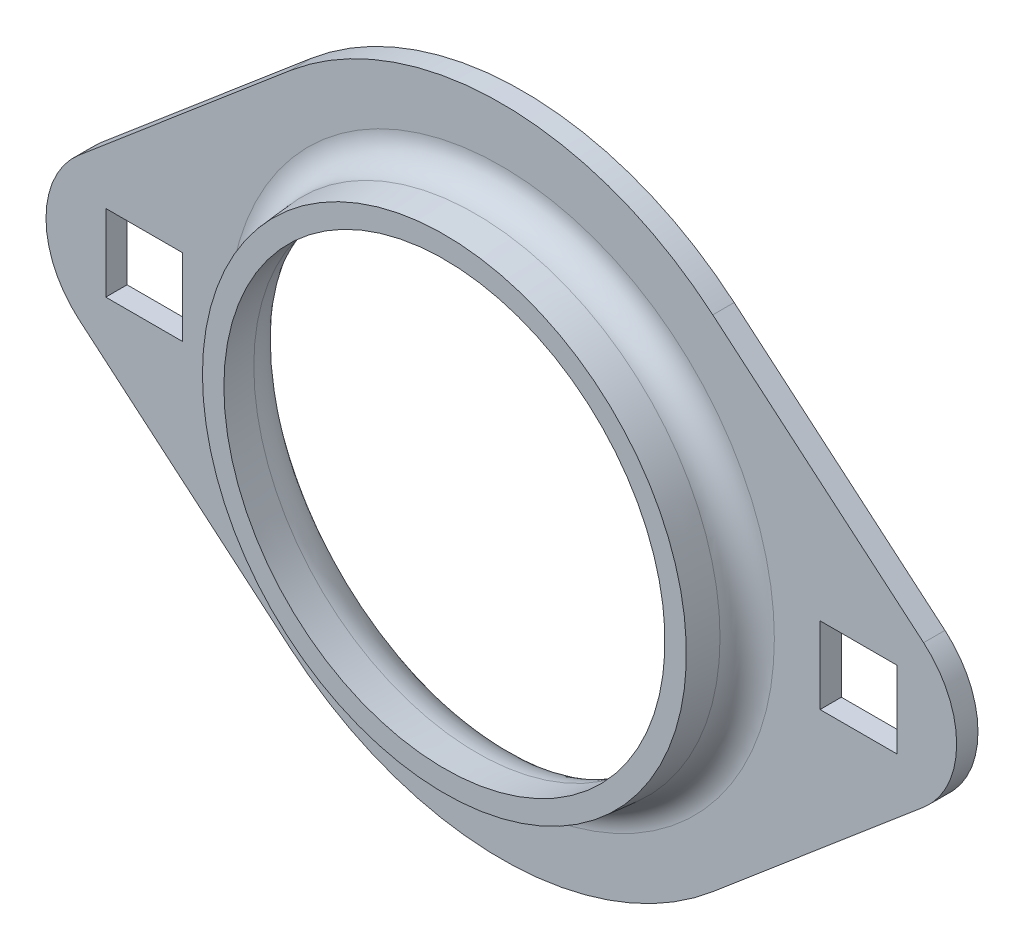
ISO-10303-21;
HEADER;
FILE_DESCRIPTION(('STEP AP214'),'2;1');
FILE_NAME('part.step','',(''),(''),'','','');
FILE_SCHEMA(('AUTOMOTIVE_DESIGN { 1 0 10303 214 1 1 1 1 }'));
ENDSEC;
DATA;
#1=APPLICATION_CONTEXT('core data for automotive mechanical design processes');
#2=APPLICATION_PROTOCOL_DEFINITION('international standard','automotive_design',2000,#1);
#3=PRODUCT_CONTEXT('',#1,'mechanical');
#4=PRODUCT('Part','Part','',(#3));
#5=PRODUCT_RELATED_PRODUCT_CATEGORY('part','',(#4));
#6=PRODUCT_DEFINITION_FORMATION('','',#4);
#7=PRODUCT_DEFINITION_CONTEXT('part definition',#1,'design');
#8=PRODUCT_DEFINITION('design','',#6,#7);
#9=PRODUCT_DEFINITION_SHAPE('','',#8);
#10=(LENGTH_UNIT() NAMED_UNIT(*) SI_UNIT(.MILLI.,.METRE.));
#11=(NAMED_UNIT(*) PLANE_ANGLE_UNIT() SI_UNIT($,.RADIAN.));
#12=(NAMED_UNIT(*) SI_UNIT($,.STERADIAN.) SOLID_ANGLE_UNIT());
#13=UNCERTAINTY_MEASURE_WITH_UNIT(LENGTH_MEASURE(1.E-05),#10,'distance_accuracy_value','');
#14=(GEOMETRIC_REPRESENTATION_CONTEXT(3) GLOBAL_UNCERTAINTY_ASSIGNED_CONTEXT((#13)) GLOBAL_UNIT_ASSIGNED_CONTEXT((#10,
#11,#12)) REPRESENTATION_CONTEXT('',''));
#15=CARTESIAN_POINT('',(0.,0.,0.));
#16=DIRECTION('',(0.,0.,1.));
#17=DIRECTION('',(1.,0.,0.));
#18=AXIS2_PLACEMENT_3D('',#15,#16,#17);
#19=CARTESIAN_POINT('',(8.334375,0.,1.905));
#20=DIRECTION('',(0.,0.,1.));
#21=DIRECTION('',(1.,0.,0.));
#22=AXIS2_PLACEMENT_3D('',#19,#20,#21);
#23=PLANE('',#22);
#24=CARTESIAN_POINT('',(8.334375,0.,1.905));
#25=DIRECTION('',(0.,0.,1.));
#26=DIRECTION('',(1.,0.,0.));
#27=AXIS2_PLACEMENT_3D('',#24,#25,#26);
#28=CIRCLE('',#27,8.334375);
#29=CARTESIAN_POINT('',(2.9487714987715,6.36058814640442,1.905));
#30=VERTEX_POINT('',#29);
#31=CARTESIAN_POINT('',(2.9487714987715,-6.36058814640442,1.905));
#32=VERTEX_POINT('',#31);
#33=EDGE_CURVE('E9',#30,#32,#28,.T.);
#34=ORIENTED_EDGE('',*,*,#33,.T.);
#35=DIRECTION('',(0.763175180670946,-0.646191646191646,0.));
#36=VECTOR('',#35,1.);
#37=CARTESIAN_POINT('',(2.9487714987715,-6.36058814640442,1.905));
#38=LINE('',#37,#36);
#39=CARTESIAN_POINT('',(21.764742014742,-22.2923470273983,1.905));
#40=VERTEX_POINT('',#39);
#41=EDGE_CURVE('E26',#32,#40,#38,.T.);
#42=ORIENTED_EDGE('',*,*,#41,.T.);
#43=CARTESIAN_POINT('',(40.64,1.61676227961039E-12,1.905));
#44=DIRECTION('',(0.,0.,1.));
#45=DIRECTION('',(1.,0.,0.));
#46=AXIS2_PLACEMENT_3D('',#43,#44,#45);
#47=CIRCLE('',#46,29.2100000000012);
#48=CARTESIAN_POINT('',(59.515257985258,-22.2923470273984,1.905));
#49=VERTEX_POINT('',#48);
#50=EDGE_CURVE('E222',#40,#49,#47,.T.);
#51=ORIENTED_EDGE('',*,*,#50,.T.);
#52=DIRECTION('',(0.763175180670946,0.646191646191646,0.));
#53=VECTOR('',#52,1.);
#54=CARTESIAN_POINT('',(78.3312285012285,-6.36058814640442,1.905));
#55=LINE('',#54,#53);
#56=CARTESIAN_POINT('',(78.3312285012285,-6.36058814640442,1.905));
#57=VERTEX_POINT('',#56);
#58=EDGE_CURVE('E299',#49,#57,#55,.T.);
#59=ORIENTED_EDGE('',*,*,#58,.T.);
#60=CARTESIAN_POINT('',(72.945625,0.,1.905));
#61=DIRECTION('',(0.,0.,1.));
#62=DIRECTION('',(-1.,0.,0.));
#63=AXIS2_PLACEMENT_3D('',#60,#61,#62);
#64=CIRCLE('',#63,8.334375);
#65=CARTESIAN_POINT('',(78.3312285012285,6.36058814640442,1.905));
#66=VERTEX_POINT('',#65);
#67=EDGE_CURVE('E185',#57,#66,#64,.T.);
#68=ORIENTED_EDGE('',*,*,#67,.T.);
#69=DIRECTION('',(-0.763175180670946,0.646191646191646,0.));
#70=VECTOR('',#69,1.);
#71=CARTESIAN_POINT('',(78.3312285012285,6.36058814640442,1.905));
#72=LINE('',#71,#70);
#73=CARTESIAN_POINT('',(59.515257985258,22.2923470273983,1.905));
#74=VERTEX_POINT('',#73);
#75=EDGE_CURVE('E181',#66,#74,#72,.T.);
#76=ORIENTED_EDGE('',*,*,#75,.T.);
#77=CARTESIAN_POINT('',(40.64,3.33066907387547E-13,1.905));
#78=DIRECTION('',(0.,0.,1.));
#79=DIRECTION('',(1.,0.,0.));
#80=AXIS2_PLACEMENT_3D('',#77,#78,#79);
#81=CIRCLE('',#80,29.21);
#82=CARTESIAN_POINT('',(21.7647420147421,22.2923470273983,1.905));
#83=VERTEX_POINT('',#82);
#84=EDGE_CURVE('E186',#74,#83,#81,.T.);
#85=ORIENTED_EDGE('',*,*,#84,.T.);
#86=DIRECTION('',(-0.763175180670946,-0.646191646191646,0.));
#87=VECTOR('',#86,1.);
#88=CARTESIAN_POINT('',(2.9487714987715,6.36058814640442,1.905));
#89=LINE('',#88,#87);
#90=EDGE_CURVE('E210',#83,#30,#89,.T.);
#91=ORIENTED_EDGE('',*,*,#90,.T.);
#92=EDGE_LOOP('',(#34,#42,#51,#59,#68,#76,#85,#91));
#93=FACE_BOUND('',#92,.T.);
#94=DIRECTION('',(0.,-1.,0.));
#95=VECTOR('',#94,1.);
#96=CARTESIAN_POINT('',(69.088,3.429,1.905));
#97=LINE('',#96,#95);
#98=CARTESIAN_POINT('',(69.088,3.429,1.905));
#99=VERTEX_POINT('',#98);
#100=CARTESIAN_POINT('',(69.088,-3.429,1.905));
#101=VERTEX_POINT('',#100);
#102=EDGE_CURVE('E156',#99,#101,#97,.T.);
#103=ORIENTED_EDGE('',*,*,#102,.F.);
#104=DIRECTION('',(-1.,0.,0.));
#105=VECTOR('',#104,1.);
#106=CARTESIAN_POINT('',(75.946,3.429,1.905));
#107=LINE('',#106,#105);
#108=CARTESIAN_POINT('',(75.946,3.429,1.905));
#109=VERTEX_POINT('',#108);
#110=EDGE_CURVE('E152',#109,#99,#107,.T.);
#111=ORIENTED_EDGE('',*,*,#110,.F.);
#112=DIRECTION('',(0.,1.,0.));
#113=VECTOR('',#112,1.);
#114=CARTESIAN_POINT('',(75.946,-3.429,1.905));
#115=LINE('',#114,#113);
#116=CARTESIAN_POINT('',(75.946,-3.429,1.905));
#117=VERTEX_POINT('',#116);
#118=EDGE_CURVE('E246',#117,#109,#115,.T.);
#119=ORIENTED_EDGE('',*,*,#118,.F.);
#120=DIRECTION('',(1.,0.,0.));
#121=VECTOR('',#120,1.);
#122=CARTESIAN_POINT('',(69.088,-3.429,1.905));
#123=LINE('',#122,#121);
#124=EDGE_CURVE('E247',#101,#117,#123,.T.);
#125=ORIENTED_EDGE('',*,*,#124,.F.);
#126=EDGE_LOOP('',(#103,#111,#119,#125));
#127=FACE_BOUND('',#126,.T.);
#128=DIRECTION('',(0.,-1.,0.));
#129=VECTOR('',#128,1.);
#130=CARTESIAN_POINT('',(12.192,3.429,1.905));
#131=LINE('',#130,#129);
#132=CARTESIAN_POINT('',(12.192,3.429,1.905));
#133=VERTEX_POINT('',#132);
#134=CARTESIAN_POINT('',(12.192,-3.429,1.905));
#135=VERTEX_POINT('',#134);
#136=EDGE_CURVE('E214',#133,#135,#131,.T.);
#137=ORIENTED_EDGE('',*,*,#136,.T.);
#138=DIRECTION('',(-1.,0.,0.));
#139=VECTOR('',#138,1.);
#140=CARTESIAN_POINT('',(12.192,-3.429,1.905));
#141=LINE('',#140,#139);
#142=CARTESIAN_POINT('',(5.334,-3.429,1.905));
#143=VERTEX_POINT('',#142);
#144=EDGE_CURVE('E215',#135,#143,#141,.T.);
#145=ORIENTED_EDGE('',*,*,#144,.T.);
#146=DIRECTION('',(0.,1.,0.));
#147=VECTOR('',#146,1.);
#148=CARTESIAN_POINT('',(5.334,-3.429,1.905));
#149=LINE('',#148,#147);
#150=CARTESIAN_POINT('',(5.334,3.429,1.905));
#151=VERTEX_POINT('',#150);
#152=EDGE_CURVE('E219',#143,#151,#149,.T.);
#153=ORIENTED_EDGE('',*,*,#152,.T.);
#154=DIRECTION('',(1.,0.,0.));
#155=VECTOR('',#154,1.);
#156=CARTESIAN_POINT('',(5.334,3.429,1.905));
#157=LINE('',#156,#155);
#158=EDGE_CURVE('E253',#151,#133,#157,.T.);
#159=ORIENTED_EDGE('',*,*,#158,.T.);
#160=EDGE_LOOP('',(#137,#145,#153,#159));
#161=FACE_BOUND('',#160,.T.);
#162=CARTESIAN_POINT('',(40.64,0.,1.905));
#163=DIRECTION('',(0.,0.,-1.));
#164=DIRECTION('',(1.,0.,0.));
#165=AXIS2_PLACEMENT_3D('',#162,#163,#164);
#166=CIRCLE('',#165,24.3692003832361);
#167=CARTESIAN_POINT('',(65.0092003832361,0.,1.905));
#168=VERTEX_POINT('',#167);
#169=EDGE_CURVE('E257',#168,#168,#166,.T.);
#170=ORIENTED_EDGE('',*,*,#169,.T.);
#171=EDGE_LOOP('',(#170));
#172=FACE_BOUND('',#171,.T.);
#173=ADVANCED_FACE('F15',(#93,#127,#161,#172),#23,.T.);
#174=CARTESIAN_POINT('',(40.64,0.,6.985));
#175=DIRECTION('',(0.,0.,-1.));
#176=DIRECTION('',(-1.,0.,0.));
#177=AXIS2_PLACEMENT_3D('',#174,#175,#176);
#178=CONICAL_SURFACE('',#177,19.685,0.0872664625997163);
#179=CARTESIAN_POINT('',(40.64,0.,4.05759272348666));
#180=DIRECTION('',(0.,0.,-1.));
#181=DIRECTION('',(-1.,0.,0.));
#182=AXIS2_PLACEMENT_3D('',#179,#180,#181);
#183=CIRCLE('',#182,19.9411149502182);
#184=CARTESIAN_POINT('',(20.6988850497818,0.,4.05759272348666));
#185=VERTEX_POINT('',#184);
#186=EDGE_CURVE('E258',#185,#185,#183,.T.);
#187=ORIENTED_EDGE('',*,*,#186,.T.);
#188=EDGE_LOOP('',(#187));
#189=FACE_BOUND('',#188,.T.);
#190=CARTESIAN_POINT('',(40.64,0.,6.985));
#191=DIRECTION('',(0.,0.,-1.));
#192=DIRECTION('',(-1.,0.,0.));
#193=AXIS2_PLACEMENT_3D('',#190,#191,#192);
#194=CIRCLE('',#193,19.685);
#195=CARTESIAN_POINT('',(20.955,0.,6.985));
#196=VERTEX_POINT('',#195);
#197=EDGE_CURVE('E173',#196,#196,#194,.T.);
#198=ORIENTED_EDGE('',*,*,#197,.F.);
#199=EDGE_LOOP('',(#198));
#200=FACE_BOUND('',#199,.T.);
#201=ADVANCED_FACE('F435',(#189,#200),#178,.F.);
#202=CARTESIAN_POINT('',(12.192,-3.429,-1.42161072516215));
#203=DIRECTION('',(0.,1.,0.));
#204=DIRECTION('',(1.,0.,0.));
#205=AXIS2_PLACEMENT_3D('',#202,#203,#204);
#206=PLANE('',#205);
#207=DIRECTION('',(-1.,0.,0.));
#208=VECTOR('',#207,1.);
#209=CARTESIAN_POINT('',(8.334375,-3.429,0.));
#210=LINE('',#209,#208);
#211=CARTESIAN_POINT('',(12.192,-3.429,0.));
#212=VERTEX_POINT('',#211);
#213=CARTESIAN_POINT('',(5.334,-3.429,0.));
#214=VERTEX_POINT('',#213);
#215=EDGE_CURVE('E262',#212,#214,#210,.T.);
#216=ORIENTED_EDGE('',*,*,#215,.T.);
#217=DIRECTION('',(0.,0.,1.));
#218=VECTOR('',#217,1.);
#219=CARTESIAN_POINT('',(5.334,-3.429,-1.42161072516215));
#220=LINE('',#219,#218);
#221=EDGE_CURVE('E274',#214,#143,#220,.T.);
#222=ORIENTED_EDGE('',*,*,#221,.T.);
#223=ORIENTED_EDGE('',*,*,#144,.F.);
#224=DIRECTION('',(0.,0.,1.));
#225=VECTOR('',#224,1.);
#226=CARTESIAN_POINT('',(12.192,-3.429,-1.42161072516215));
#227=LINE('',#226,#225);
#228=EDGE_CURVE('E174',#212,#135,#227,.T.);
#229=ORIENTED_EDGE('',*,*,#228,.F.);
#230=EDGE_LOOP('',(#216,#222,#223,#229));
#231=FACE_BOUND('',#230,.T.);
#232=ADVANCED_FACE('F440',(#231),#206,.T.);
#233=CARTESIAN_POINT('',(5.334,-3.429,-1.42161072516215));
#234=DIRECTION('',(1.,0.,0.));
#235=DIRECTION('',(0.,1.,0.));
#236=AXIS2_PLACEMENT_3D('',#233,#234,#235);
#237=PLANE('',#236);
#238=DIRECTION('',(0.,1.,0.));
#239=VECTOR('',#238,1.);
#240=CARTESIAN_POINT('',(5.334,0.,0.));
#241=LINE('',#240,#239);
#242=CARTESIAN_POINT('',(5.334,3.429,0.));
#243=VERTEX_POINT('',#242);
#244=EDGE_CURVE('E194',#214,#243,#241,.T.);
#245=ORIENTED_EDGE('',*,*,#244,.T.);
#246=DIRECTION('',(0.,0.,1.));
#247=VECTOR('',#246,1.);
#248=CARTESIAN_POINT('',(5.334,3.429,-1.42161072516215));
#249=LINE('',#248,#247);
#250=EDGE_CURVE('E190',#243,#151,#249,.T.);
#251=ORIENTED_EDGE('',*,*,#250,.T.);
#252=ORIENTED_EDGE('',*,*,#152,.F.);
#253=ORIENTED_EDGE('',*,*,#221,.F.);
#254=EDGE_LOOP('',(#245,#251,#252,#253));
#255=FACE_BOUND('',#254,.T.);
#256=ADVANCED_FACE('F347',(#255),#237,.T.);
#257=CARTESIAN_POINT('',(40.64,0.,4.445));
#258=DIRECTION('',(0.,0.,1.));
#259=DIRECTION('',(1.,0.,0.));
#260=AXIS2_PLACEMENT_3D('',#257,#258,#259);
#261=TOROIDAL_SURFACE('',#260,24.3692003832361,2.54);
#262=CARTESIAN_POINT('',(40.64,0.,4.22362441342095));
#263=DIRECTION('',(0.,0.,1.));
#264=DIRECTION('',(-1.,0.,0.));
#265=AXIS2_PLACEMENT_3D('',#262,#263,#264);
#266=CIRCLE('',#265,21.838865850083);
#267=CARTESIAN_POINT('',(18.801134149917,0.,4.22362441342095));
#268=VERTEX_POINT('',#267);
#269=EDGE_CURVE('E195',#268,#268,#266,.T.);
#270=ORIENTED_EDGE('',*,*,#269,.F.);
#271=EDGE_LOOP('',(#270));
#272=FACE_BOUND('',#271,.T.);
#273=ORIENTED_EDGE('',*,*,#169,.F.);
#274=EDGE_LOOP('',(#273));
#275=FACE_BOUND('',#274,.T.);
#276=ADVANCED_FACE('F453',(#272,#275),#261,.F.);
#277=CARTESIAN_POINT('',(40.64,0.,4.445));
#278=DIRECTION('',(0.,0.,-1.));
#279=DIRECTION('',(-1.,0.,0.));
#280=AXIS2_PLACEMENT_3D('',#277,#278,#279);
#281=TOROIDAL_SURFACE('',#280,24.3692003832361,4.445);
#282=ORIENTED_EDGE('',*,*,#186,.F.);
#283=EDGE_LOOP('',(#282));
#284=FACE_BOUND('',#283,.T.);
#285=CARTESIAN_POINT('',(40.64,0.,0.));
#286=DIRECTION('',(0.,0.,1.));
#287=DIRECTION('',(-1.,0.,0.));
#288=AXIS2_PLACEMENT_3D('',#285,#286,#287);
#289=CIRCLE('',#288,24.3692003832361);
#290=CARTESIAN_POINT('',(16.2707996167639,0.,0.));
#291=VERTEX_POINT('',#290);
#292=EDGE_CURVE('E148',#291,#291,#289,.T.);
#293=ORIENTED_EDGE('',*,*,#292,.F.);
#294=EDGE_LOOP('',(#293));
#295=FACE_BOUND('',#294,.T.);
#296=ADVANCED_FACE('F468',(#284,#295),#281,.T.);
#297=CARTESIAN_POINT('',(40.64,0.,7.15103168993429));
#298=DIRECTION('',(0.,0.,-1.));
#299=DIRECTION('',(-1.,0.,0.));
#300=AXIS2_PLACEMENT_3D('',#297,#298,#299);
#301=CONICAL_SURFACE('',#300,21.5827508998648,0.0872664625997163);
#302=ORIENTED_EDGE('',*,*,#269,.T.);
#303=EDGE_LOOP('',(#302));
#304=FACE_BOUND('',#303,.T.);
#305=CARTESIAN_POINT('',(40.64,0.,6.985));
#306=DIRECTION('',(0.,0.,-1.));
#307=DIRECTION('',(-1.,0.,0.));
#308=AXIS2_PLACEMENT_3D('',#305,#306,#307);
#309=CIRCLE('',#308,21.5972767905201);
#310=CARTESIAN_POINT('',(19.0427232094799,0.,6.985));
#311=VERTEX_POINT('',#310);
#312=EDGE_CURVE('E226',#311,#311,#309,.T.);
#313=ORIENTED_EDGE('',*,*,#312,.T.);
#314=EDGE_LOOP('',(#313));
#315=FACE_BOUND('',#314,.T.);
#316=ADVANCED_FACE('F472',(#304,#315),#301,.T.);
#317=CARTESIAN_POINT('',(40.64,0.,6.985));
#318=DIRECTION('',(0.,0.,-1.));
#319=DIRECTION('',(0.,-1.,0.));
#320=AXIS2_PLACEMENT_3D('',#317,#318,#319);
#321=PLANE('',#320);
#322=ORIENTED_EDGE('',*,*,#312,.F.);
#323=EDGE_LOOP('',(#322));
#324=FACE_BOUND('',#323,.T.);
#325=ORIENTED_EDGE('',*,*,#197,.T.);
#326=EDGE_LOOP('',(#325));
#327=FACE_BOUND('',#326,.T.);
#328=ADVANCED_FACE('F476',(#324,#327),#321,.F.);
#329=CARTESIAN_POINT('',(12.192,3.429,-1.42161072516215));
#330=DIRECTION('',(-1.,0.,0.));
#331=DIRECTION('',(0.,1.,0.));
#332=AXIS2_PLACEMENT_3D('',#329,#330,#331);
#333=PLANE('',#332);
#334=DIRECTION('',(0.,-1.,0.));
#335=VECTOR('',#334,1.);
#336=CARTESIAN_POINT('',(12.192,0.,0.));
#337=LINE('',#336,#335);
#338=CARTESIAN_POINT('',(12.192,3.429,0.));
#339=VERTEX_POINT('',#338);
#340=EDGE_CURVE('E171',#339,#212,#337,.T.);
#341=ORIENTED_EDGE('',*,*,#340,.T.);
#342=ORIENTED_EDGE('',*,*,#228,.T.);
#343=ORIENTED_EDGE('',*,*,#136,.F.);
#344=DIRECTION('',(0.,0.,1.));
#345=VECTOR('',#344,1.);
#346=CARTESIAN_POINT('',(12.192,3.429,-1.42161072516215));
#347=LINE('',#346,#345);
#348=EDGE_CURVE('E231',#339,#133,#347,.T.);
#349=ORIENTED_EDGE('',*,*,#348,.F.);
#350=EDGE_LOOP('',(#341,#342,#343,#349));
#351=FACE_BOUND('',#350,.T.);
#352=ADVANCED_FACE('F430',(#351),#333,.T.);
#353=CARTESIAN_POINT('',(8.334375,0.,0.));
#354=DIRECTION('',(0.,0.,1.));
#355=DIRECTION('',(1.,0.,0.));
#356=AXIS2_PLACEMENT_3D('',#353,#354,#355);
#357=PLANE('',#356);
#358=CARTESIAN_POINT('',(8.334375,0.,0.));
#359=DIRECTION('',(0.,0.,1.));
#360=DIRECTION('',(1.,0.,0.));
#361=AXIS2_PLACEMENT_3D('',#358,#359,#360);
#362=CIRCLE('',#361,8.334375);
#363=CARTESIAN_POINT('',(2.9487714987715,6.36058814640442,0.));
#364=VERTEX_POINT('',#363);
#365=CARTESIAN_POINT('',(2.9487714987715,-6.36058814640442,0.));
#366=VERTEX_POINT('',#365);
#367=EDGE_CURVE('E163',#364,#366,#362,.T.);
#368=ORIENTED_EDGE('',*,*,#367,.F.);
#369=DIRECTION('',(-0.763175180670946,-0.646191646191646,0.));
#370=VECTOR('',#369,1.);
#371=CARTESIAN_POINT('',(2.9487714987715,6.36058814640442,0.));
#372=LINE('',#371,#370);
#373=CARTESIAN_POINT('',(21.7647420147421,22.2923470273983,0.));
#374=VERTEX_POINT('',#373);
#375=EDGE_CURVE('E166',#374,#364,#372,.T.);
#376=ORIENTED_EDGE('',*,*,#375,.F.);
#377=CARTESIAN_POINT('',(40.64,3.33066907387547E-13,0.));
#378=DIRECTION('',(0.,0.,1.));
#379=DIRECTION('',(1.,0.,0.));
#380=AXIS2_PLACEMENT_3D('',#377,#378,#379);
#381=CIRCLE('',#380,29.21);
#382=CARTESIAN_POINT('',(59.515257985258,22.2923470273983,0.));
#383=VERTEX_POINT('',#382);
#384=EDGE_CURVE('E252',#383,#374,#381,.T.);
#385=ORIENTED_EDGE('',*,*,#384,.F.);
#386=DIRECTION('',(-0.763175180670946,0.646191646191646,0.));
#387=VECTOR('',#386,1.);
#388=CARTESIAN_POINT('',(78.3312285012285,6.36058814640442,0.));
#389=LINE('',#388,#387);
#390=CARTESIAN_POINT('',(78.3312285012285,6.36058814640442,0.));
#391=VERTEX_POINT('',#390);
#392=EDGE_CURVE('E200',#391,#383,#389,.T.);
#393=ORIENTED_EDGE('',*,*,#392,.F.);
#394=CARTESIAN_POINT('',(72.945625,0.,0.));
#395=DIRECTION('',(0.,0.,1.));
#396=DIRECTION('',(-1.,0.,0.));
#397=AXIS2_PLACEMENT_3D('',#394,#395,#396);
#398=CIRCLE('',#397,8.334375);
#399=CARTESIAN_POINT('',(78.3312285012285,-6.36058814640442,0.));
#400=VERTEX_POINT('',#399);
#401=EDGE_CURVE('E19',#400,#391,#398,.T.);
#402=ORIENTED_EDGE('',*,*,#401,.F.);
#403=DIRECTION('',(0.763175180670946,0.646191646191646,0.));
#404=VECTOR('',#403,1.);
#405=CARTESIAN_POINT('',(78.3312285012285,-6.36058814640442,0.));
#406=LINE('',#405,#404);
#407=CARTESIAN_POINT('',(59.515257985258,-22.2923470273984,0.));
#408=VERTEX_POINT('',#407);
#409=EDGE_CURVE('E205',#408,#400,#406,.T.);
#410=ORIENTED_EDGE('',*,*,#409,.F.);
#411=CARTESIAN_POINT('',(40.64,1.61676227961039E-12,0.));
#412=DIRECTION('',(0.,0.,1.));
#413=DIRECTION('',(1.,0.,0.));
#414=AXIS2_PLACEMENT_3D('',#411,#412,#413);
#415=CIRCLE('',#414,29.2100000000012);
#416=CARTESIAN_POINT('',(21.764742014742,-22.2923470273983,0.));
#417=VERTEX_POINT('',#416);
#418=EDGE_CURVE('E206',#417,#408,#415,.T.);
#419=ORIENTED_EDGE('',*,*,#418,.F.);
#420=DIRECTION('',(0.763175180670946,-0.646191646191646,0.));
#421=VECTOR('',#420,1.);
#422=CARTESIAN_POINT('',(2.9487714987715,-6.36058814640442,0.));
#423=LINE('',#422,#421);
#424=EDGE_CURVE('E176',#366,#417,#423,.T.);
#425=ORIENTED_EDGE('',*,*,#424,.F.);
#426=EDGE_LOOP('',(#368,#376,#385,#393,#402,#410,#419,#425));
#427=FACE_BOUND('',#426,.T.);
#428=ORIENTED_EDGE('',*,*,#292,.T.);
#429=EDGE_LOOP('',(#428));
#430=FACE_BOUND('',#429,.T.);
#431=DIRECTION('',(-1.,0.,0.));
#432=VECTOR('',#431,1.);
#433=CARTESIAN_POINT('',(8.334375,3.42900000000015,0.));
#434=LINE('',#433,#432);
#435=CARTESIAN_POINT('',(75.946,3.429,0.));
#436=VERTEX_POINT('',#435);
#437=CARTESIAN_POINT('',(69.088,3.429,0.));
#438=VERTEX_POINT('',#437);
#439=EDGE_CURVE('E138',#436,#438,#434,.T.);
#440=ORIENTED_EDGE('',*,*,#439,.T.);
#441=DIRECTION('',(0.,-1.,0.));
#442=VECTOR('',#441,1.);
#443=CARTESIAN_POINT('',(69.088,-1.34629096065764E-13,0.));
#444=LINE('',#443,#442);
#445=CARTESIAN_POINT('',(69.088,-3.429,0.));
#446=VERTEX_POINT('',#445);
#447=EDGE_CURVE('E130',#438,#446,#444,.T.);
#448=ORIENTED_EDGE('',*,*,#447,.T.);
#449=DIRECTION('',(1.,0.,0.));
#450=VECTOR('',#449,1.);
#451=CARTESIAN_POINT('',(8.334375,-3.42899999999973,0.));
#452=LINE('',#451,#450);
#453=CARTESIAN_POINT('',(75.946,-3.429,0.));
#454=VERTEX_POINT('',#453);
#455=EDGE_CURVE('E122',#446,#454,#452,.T.);
#456=ORIENTED_EDGE('',*,*,#455,.T.);
#457=DIRECTION('',(0.,1.,0.));
#458=VECTOR('',#457,1.);
#459=CARTESIAN_POINT('',(75.946,-1.4235051679079E-13,0.));
#460=LINE('',#459,#458);
#461=EDGE_CURVE('E143',#454,#436,#460,.T.);
#462=ORIENTED_EDGE('',*,*,#461,.T.);
#463=EDGE_LOOP('',(#440,#448,#456,#462));
#464=FACE_BOUND('',#463,.T.);
#465=ORIENTED_EDGE('',*,*,#215,.F.);
#466=ORIENTED_EDGE('',*,*,#340,.F.);
#467=DIRECTION('',(1.,0.,0.));
#468=VECTOR('',#467,1.);
#469=CARTESIAN_POINT('',(8.334375,3.429,0.));
#470=LINE('',#469,#468);
#471=EDGE_CURVE('E227',#243,#339,#470,.T.);
#472=ORIENTED_EDGE('',*,*,#471,.F.);
#473=ORIENTED_EDGE('',*,*,#244,.F.);
#474=EDGE_LOOP('',(#465,#466,#472,#473));
#475=FACE_BOUND('',#474,.T.);
#476=ADVANCED_FACE('F141',(#427,#430,#464,#475),#357,.F.);
#477=CARTESIAN_POINT('',(8.334375,0.,1.905));
#478=DIRECTION('',(0.,0.,1.));
#479=DIRECTION('',(-1.,0.,0.));
#480=AXIS2_PLACEMENT_3D('',#477,#478,#479);
#481=CYLINDRICAL_SURFACE('',#480,8.334375);
#482=ORIENTED_EDGE('',*,*,#367,.T.);
#483=DIRECTION('',(0.,0.,-1.));
#484=VECTOR('',#483,1.);
#485=CARTESIAN_POINT('',(2.9487714987715,-6.36058814640442,1.905));
#486=LINE('',#485,#484);
#487=EDGE_CURVE('E180',#32,#366,#486,.T.);
#488=ORIENTED_EDGE('',*,*,#487,.F.);
#489=ORIENTED_EDGE('',*,*,#33,.F.);
#490=DIRECTION('',(0.,0.,-1.));
#491=VECTOR('',#490,1.);
#492=CARTESIAN_POINT('',(2.9487714987715,6.36058814640442,1.905));
#493=LINE('',#492,#491);
#494=EDGE_CURVE('E155',#30,#364,#493,.T.);
#495=ORIENTED_EDGE('',*,*,#494,.T.);
#496=EDGE_LOOP('',(#482,#488,#489,#495));
#497=FACE_BOUND('',#496,.T.);
#498=ADVANCED_FACE('F422',(#497),#481,.T.);
#499=CARTESIAN_POINT('',(69.088,3.429,-1.42161072516215));
#500=DIRECTION('',(-1.,0.,0.));
#501=DIRECTION('',(0.,0.,1.));
#502=AXIS2_PLACEMENT_3D('',#499,#500,#501);
#503=PLANE('',#502);
#504=DIRECTION('',(0.,0.,1.));
#505=VECTOR('',#504,1.);
#506=CARTESIAN_POINT('',(69.088,3.429,-1.42161072516215));
#507=LINE('',#506,#505);
#508=EDGE_CURVE('E134',#438,#99,#507,.T.);
#509=ORIENTED_EDGE('',*,*,#508,.T.);
#510=ORIENTED_EDGE('',*,*,#102,.T.);
#511=DIRECTION('',(0.,0.,1.));
#512=VECTOR('',#511,1.);
#513=CARTESIAN_POINT('',(69.088,-3.429,-1.42161072516215));
#514=LINE('',#513,#512);
#515=EDGE_CURVE('E135',#446,#101,#514,.T.);
#516=ORIENTED_EDGE('',*,*,#515,.F.);
#517=ORIENTED_EDGE('',*,*,#447,.F.);
#518=EDGE_LOOP('',(#509,#510,#516,#517));
#519=FACE_BOUND('',#518,.T.);
#520=ADVANCED_FACE('F17',(#519),#503,.F.);
#521=CARTESIAN_POINT('',(2.9487714987715,6.36058814640442,1.905));
#522=DIRECTION('',(0.646191646191646,-0.763175180670946,0.));
#523=DIRECTION('',(0.,0.,-1.));
#524=AXIS2_PLACEMENT_3D('',#521,#522,#523);
#525=PLANE('',#524);
#526=ORIENTED_EDGE('',*,*,#375,.T.);
#527=ORIENTED_EDGE('',*,*,#494,.F.);
#528=ORIENTED_EDGE('',*,*,#90,.F.);
#529=DIRECTION('',(0.,0.,-1.));
#530=VECTOR('',#529,1.);
#531=CARTESIAN_POINT('',(21.7647420147421,22.2923470273983,1.905));
#532=LINE('',#531,#530);
#533=EDGE_CURVE('E248',#83,#374,#532,.T.);
#534=ORIENTED_EDGE('',*,*,#533,.T.);
#535=EDGE_LOOP('',(#526,#527,#528,#534));
#536=FACE_BOUND('',#535,.T.);
#537=ADVANCED_FACE('F405',(#536),#525,.F.);
#538=CARTESIAN_POINT('',(40.64,3.33066907387547E-13,1.905));
#539=DIRECTION('',(0.,0.,1.));
#540=DIRECTION('',(-1.,0.,0.));
#541=AXIS2_PLACEMENT_3D('',#538,#539,#540);
#542=CYLINDRICAL_SURFACE('',#541,29.21);
#543=ORIENTED_EDGE('',*,*,#384,.T.);
#544=ORIENTED_EDGE('',*,*,#533,.F.);
#545=ORIENTED_EDGE('',*,*,#84,.F.);
#546=DIRECTION('',(0.,0.,-1.));
#547=VECTOR('',#546,1.);
#548=CARTESIAN_POINT('',(59.515257985258,22.2923470273983,1.905));
#549=LINE('',#548,#547);
#550=EDGE_CURVE('E271',#74,#383,#549,.T.);
#551=ORIENTED_EDGE('',*,*,#550,.T.);
#552=EDGE_LOOP('',(#543,#544,#545,#551));
#553=FACE_BOUND('',#552,.T.);
#554=ADVANCED_FACE('F397',(#553),#542,.T.);
#555=CARTESIAN_POINT('',(78.3312285012285,6.36058814640442,1.905));
#556=DIRECTION('',(-0.646191646191646,-0.763175180670946,0.));
#557=DIRECTION('',(-0.763175180670946,0.646191646191646,0.));
#558=AXIS2_PLACEMENT_3D('',#555,#556,#557);
#559=PLANE('',#558);
#560=ORIENTED_EDGE('',*,*,#392,.T.);
#561=ORIENTED_EDGE('',*,*,#550,.F.);
#562=ORIENTED_EDGE('',*,*,#75,.F.);
#563=DIRECTION('',(0.,0.,-1.));
#564=VECTOR('',#563,1.);
#565=CARTESIAN_POINT('',(78.3312285012285,6.36058814640442,1.905));
#566=LINE('',#565,#564);
#567=EDGE_CURVE('E196',#66,#391,#566,.T.);
#568=ORIENTED_EDGE('',*,*,#567,.T.);
#569=EDGE_LOOP('',(#560,#561,#562,#568));
#570=FACE_BOUND('',#569,.T.);
#571=ADVANCED_FACE('F411',(#570),#559,.F.);
#572=CARTESIAN_POINT('',(72.945625,0.,1.905));
#573=DIRECTION('',(0.,0.,1.));
#574=DIRECTION('',(-1.,0.,0.));
#575=AXIS2_PLACEMENT_3D('',#572,#573,#574);
#576=CYLINDRICAL_SURFACE('',#575,8.334375);
#577=ORIENTED_EDGE('',*,*,#401,.T.);
#578=ORIENTED_EDGE('',*,*,#567,.F.);
#579=ORIENTED_EDGE('',*,*,#67,.F.);
#580=DIRECTION('',(0.,0.,-1.));
#581=VECTOR('',#580,1.);
#582=CARTESIAN_POINT('',(78.3312285012285,-6.36058814640442,1.905));
#583=LINE('',#582,#581);
#584=EDGE_CURVE('E283',#57,#400,#583,.T.);
#585=ORIENTED_EDGE('',*,*,#584,.T.);
#586=EDGE_LOOP('',(#577,#578,#579,#585));
#587=FACE_BOUND('',#586,.T.);
#588=ADVANCED_FACE('F415',(#587),#576,.T.);
#589=CARTESIAN_POINT('',(78.3312285012285,-6.36058814640442,1.905));
#590=DIRECTION('',(-0.646191646191646,0.763175180670946,0.));
#591=DIRECTION('',(0.,0.,1.));
#592=AXIS2_PLACEMENT_3D('',#589,#590,#591);
#593=PLANE('',#592);
#594=ORIENTED_EDGE('',*,*,#409,.T.);
#595=ORIENTED_EDGE('',*,*,#584,.F.);
#596=ORIENTED_EDGE('',*,*,#58,.F.);
#597=DIRECTION('',(0.,0.,-1.));
#598=VECTOR('',#597,1.);
#599=CARTESIAN_POINT('',(59.515257985258,-22.2923470273984,1.905));
#600=LINE('',#599,#598);
#601=EDGE_CURVE('E201',#49,#408,#600,.T.);
#602=ORIENTED_EDGE('',*,*,#601,.T.);
#603=EDGE_LOOP('',(#594,#595,#596,#602));
#604=FACE_BOUND('',#603,.T.);
#605=ADVANCED_FACE('F417',(#604),#593,.F.);
#606=CARTESIAN_POINT('',(40.64,1.61676227961039E-12,1.905));
#607=DIRECTION('',(0.,0.,1.));
#608=DIRECTION('',(-1.,0.,0.));
#609=AXIS2_PLACEMENT_3D('',#606,#607,#608);
#610=CYLINDRICAL_SURFACE('',#609,29.2100000000012);
#611=ORIENTED_EDGE('',*,*,#418,.T.);
#612=ORIENTED_EDGE('',*,*,#601,.F.);
#613=ORIENTED_EDGE('',*,*,#50,.F.);
#614=DIRECTION('',(0.,0.,-1.));
#615=VECTOR('',#614,1.);
#616=CARTESIAN_POINT('',(21.764742014742,-22.2923470273983,1.905));
#617=LINE('',#616,#615);
#618=EDGE_CURVE('E179',#40,#417,#617,.T.);
#619=ORIENTED_EDGE('',*,*,#618,.T.);
#620=EDGE_LOOP('',(#611,#612,#613,#619));
#621=FACE_BOUND('',#620,.T.);
#622=ADVANCED_FACE('F418',(#621),#610,.T.);
#623=CARTESIAN_POINT('',(2.9487714987715,-6.36058814640442,1.905));
#624=DIRECTION('',(0.646191646191646,0.763175180670946,0.));
#625=DIRECTION('',(0.,0.,-1.));
#626=AXIS2_PLACEMENT_3D('',#623,#624,#625);
#627=PLANE('',#626);
#628=ORIENTED_EDGE('',*,*,#424,.T.);
#629=ORIENTED_EDGE('',*,*,#618,.F.);
#630=ORIENTED_EDGE('',*,*,#41,.F.);
#631=ORIENTED_EDGE('',*,*,#487,.T.);
#632=EDGE_LOOP('',(#628,#629,#630,#631));
#633=FACE_BOUND('',#632,.T.);
#634=ADVANCED_FACE('F420',(#633),#627,.F.);
#635=CARTESIAN_POINT('',(5.334,3.429,-1.42161072516215));
#636=DIRECTION('',(0.,-1.,0.));
#637=DIRECTION('',(0.,0.,-1.));
#638=AXIS2_PLACEMENT_3D('',#635,#636,#637);
#639=PLANE('',#638);
#640=ORIENTED_EDGE('',*,*,#471,.T.);
#641=ORIENTED_EDGE('',*,*,#348,.T.);
#642=ORIENTED_EDGE('',*,*,#158,.F.);
#643=ORIENTED_EDGE('',*,*,#250,.F.);
#644=EDGE_LOOP('',(#640,#641,#642,#643));
#645=FACE_BOUND('',#644,.T.);
#646=ADVANCED_FACE('F356',(#645),#639,.T.);
#647=CARTESIAN_POINT('',(75.946,3.429,-1.42161072516215));
#648=DIRECTION('',(0.,1.,0.));
#649=DIRECTION('',(1.,0.,0.));
#650=AXIS2_PLACEMENT_3D('',#647,#648,#649);
#651=PLANE('',#650);
#652=DIRECTION('',(0.,0.,1.));
#653=VECTOR('',#652,1.);
#654=CARTESIAN_POINT('',(75.946,3.429,-1.42161072516215));
#655=LINE('',#654,#653);
#656=EDGE_CURVE('E235',#436,#109,#655,.T.);
#657=ORIENTED_EDGE('',*,*,#656,.T.);
#658=ORIENTED_EDGE('',*,*,#110,.T.);
#659=ORIENTED_EDGE('',*,*,#508,.F.);
#660=ORIENTED_EDGE('',*,*,#439,.F.);
#661=EDGE_LOOP('',(#657,#658,#659,#660));
#662=FACE_BOUND('',#661,.T.);
#663=ADVANCED_FACE('F150',(#662),#651,.F.);
#664=CARTESIAN_POINT('',(75.946,-3.429,-1.42161072516215));
#665=DIRECTION('',(1.,0.,0.));
#666=DIRECTION('',(0.,0.,1.));
#667=AXIS2_PLACEMENT_3D('',#664,#665,#666);
#668=PLANE('',#667);
#669=DIRECTION('',(0.,0.,1.));
#670=VECTOR('',#669,1.);
#671=CARTESIAN_POINT('',(75.946,-3.429,-1.42161072516215));
#672=LINE('',#671,#670);
#673=EDGE_CURVE('E280',#454,#117,#672,.T.);
#674=ORIENTED_EDGE('',*,*,#673,.T.);
#675=ORIENTED_EDGE('',*,*,#118,.T.);
#676=ORIENTED_EDGE('',*,*,#656,.F.);
#677=ORIENTED_EDGE('',*,*,#461,.F.);
#678=EDGE_LOOP('',(#674,#675,#676,#677));
#679=FACE_BOUND('',#678,.T.);
#680=ADVANCED_FACE('F449',(#679),#668,.F.);
#681=CARTESIAN_POINT('',(69.088,-3.429,-1.42161072516215));
#682=DIRECTION('',(0.,-1.,0.));
#683=DIRECTION('',(-1.,0.,0.));
#684=AXIS2_PLACEMENT_3D('',#681,#682,#683);
#685=PLANE('',#684);
#686=ORIENTED_EDGE('',*,*,#515,.T.);
#687=ORIENTED_EDGE('',*,*,#124,.T.);
#688=ORIENTED_EDGE('',*,*,#673,.F.);
#689=ORIENTED_EDGE('',*,*,#455,.F.);
#690=EDGE_LOOP('',(#686,#687,#688,#689));
#691=FACE_BOUND('',#690,.T.);
#692=ADVANCED_FACE('F446',(#691),#685,.F.);
#693=CLOSED_SHELL('',(#173,#201,#232,#256,#276,#296,#316,#328,#352,#476,#498,#520,#537,#554,
#571,#588,#605,#622,#634,#646,#663,#680,#692));
#694=MANIFOLD_SOLID_BREP('B1',#693);
#695=ADVANCED_BREP_SHAPE_REPRESENTATION('',(#18,#694),#14);
#696=SHAPE_DEFINITION_REPRESENTATION(#9,#695);
ENDSEC;
END-ISO-10303-21;
